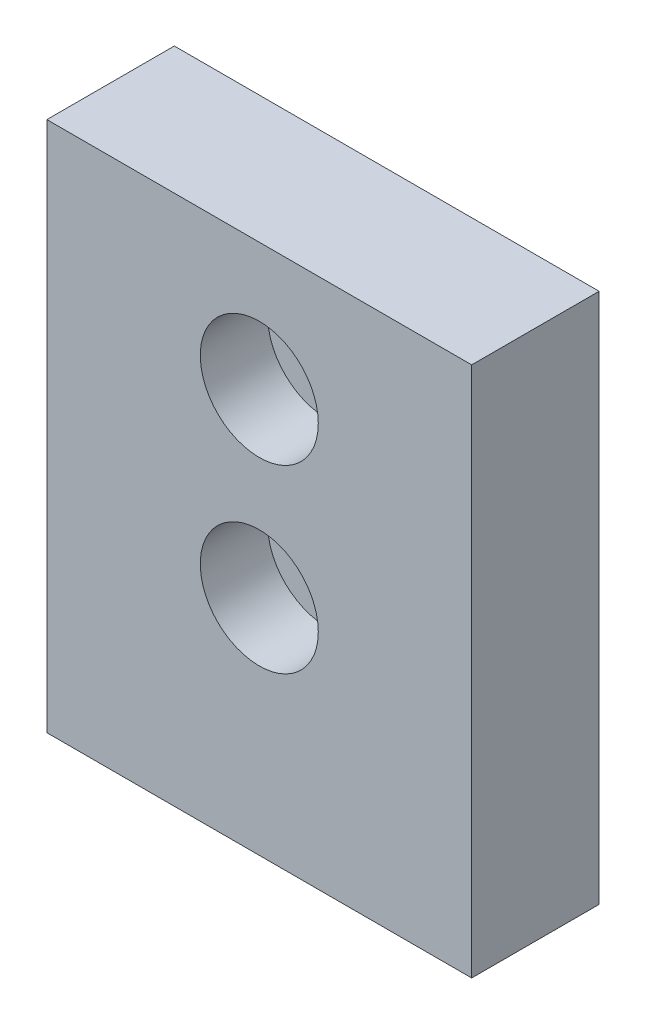
ISO-10303-21;
HEADER;
FILE_DESCRIPTION(('STEP AP214'),'2;1');
FILE_NAME('part.step','',(''),(''),'','','');
FILE_SCHEMA(('AUTOMOTIVE_DESIGN { 1 0 10303 214 1 1 1 1 }'));
ENDSEC;
DATA;
#1=APPLICATION_CONTEXT('core data for automotive mechanical design processes');
#2=APPLICATION_PROTOCOL_DEFINITION('international standard','automotive_design',2000,#1);
#3=PRODUCT_CONTEXT('',#1,'mechanical');
#4=PRODUCT('Part','Part','',(#3));
#5=PRODUCT_RELATED_PRODUCT_CATEGORY('part','',(#4));
#6=PRODUCT_DEFINITION_FORMATION('','',#4);
#7=PRODUCT_DEFINITION_CONTEXT('part definition',#1,'design');
#8=PRODUCT_DEFINITION('design','',#6,#7);
#9=PRODUCT_DEFINITION_SHAPE('','',#8);
#10=(LENGTH_UNIT() NAMED_UNIT(*) SI_UNIT(.MILLI.,.METRE.));
#11=(NAMED_UNIT(*) PLANE_ANGLE_UNIT() SI_UNIT($,.RADIAN.));
#12=(NAMED_UNIT(*) SI_UNIT($,.STERADIAN.) SOLID_ANGLE_UNIT());
#13=UNCERTAINTY_MEASURE_WITH_UNIT(LENGTH_MEASURE(1.E-05),#10,'distance_accuracy_value','');
#14=(GEOMETRIC_REPRESENTATION_CONTEXT(3) GLOBAL_UNCERTAINTY_ASSIGNED_CONTEXT((#13)) GLOBAL_UNIT_ASSIGNED_CONTEXT((#10,
#11,#12)) REPRESENTATION_CONTEXT('',''));
#15=CARTESIAN_POINT('',(0.,0.,0.));
#16=DIRECTION('',(0.,0.,1.));
#17=DIRECTION('',(1.,0.,0.));
#18=AXIS2_PLACEMENT_3D('',#15,#16,#17);
#19=CARTESIAN_POINT('',(0.,0.,12.));
#20=DIRECTION('',(0.,0.,-1.));
#21=DIRECTION('',(-1.,0.,0.));
#22=AXIS2_PLACEMENT_3D('',#19,#20,#21);
#23=PLANE('',#22);
#24=CARTESIAN_POINT('',(0.,21.,12.));
#25=DIRECTION('',(0.,0.,1.));
#26=DIRECTION('',(1.,0.,0.));
#27=AXIS2_PLACEMENT_3D('',#24,#25,#26);
#28=CIRCLE('',#27,5.55625);
#29=CARTESIAN_POINT('',(5.55625,21.,12.));
#30=VERTEX_POINT('',#29);
#31=EDGE_CURVE('E137',#30,#30,#28,.T.);
#32=ORIENTED_EDGE('',*,*,#31,.F.);
#33=EDGE_LOOP('',(#32));
#34=FACE_BOUND('',#33,.T.);
#35=DIRECTION('',(0.,-1.,0.));
#36=VECTOR('',#35,1.);
#37=CARTESIAN_POINT('',(-20.,0.,12.));
#38=LINE('',#37,#36);
#39=CARTESIAN_POINT('',(-20.,50.,12.));
#40=VERTEX_POINT('',#39);
#41=CARTESIAN_POINT('',(-20.,0.,12.));
#42=VERTEX_POINT('',#41);
#43=EDGE_CURVE('E150',#40,#42,#38,.T.);
#44=ORIENTED_EDGE('',*,*,#43,.T.);
#45=DIRECTION('',(1.,0.,0.));
#46=VECTOR('',#45,1.);
#47=CARTESIAN_POINT('',(20.,0.,12.));
#48=LINE('',#47,#46);
#49=CARTESIAN_POINT('',(20.,0.,12.));
#50=VERTEX_POINT('',#49);
#51=EDGE_CURVE('E88',#42,#50,#48,.T.);
#52=ORIENTED_EDGE('',*,*,#51,.T.);
#53=DIRECTION('',(0.,1.,0.));
#54=VECTOR('',#53,1.);
#55=CARTESIAN_POINT('',(20.,0.,12.));
#56=LINE('',#55,#54);
#57=CARTESIAN_POINT('',(20.,50.,12.));
#58=VERTEX_POINT('',#57);
#59=EDGE_CURVE('E153',#50,#58,#56,.T.);
#60=ORIENTED_EDGE('',*,*,#59,.T.);
#61=DIRECTION('',(-1.,0.,0.));
#62=VECTOR('',#61,1.);
#63=CARTESIAN_POINT('',(-20.,50.,12.));
#64=LINE('',#63,#62);
#65=EDGE_CURVE('E57',#58,#40,#64,.T.);
#66=ORIENTED_EDGE('',*,*,#65,.T.);
#67=EDGE_LOOP('',(#44,#52,#60,#66));
#68=FACE_BOUND('',#67,.T.);
#69=CARTESIAN_POINT('',(0.,38.,12.));
#70=DIRECTION('',(0.,0.,1.));
#71=DIRECTION('',(1.,0.,0.));
#72=AXIS2_PLACEMENT_3D('',#69,#70,#71);
#73=CIRCLE('',#72,5.55625);
#74=CARTESIAN_POINT('',(5.55625,38.,12.));
#75=VERTEX_POINT('',#74);
#76=EDGE_CURVE('E125',#75,#75,#73,.T.);
#77=ORIENTED_EDGE('',*,*,#76,.F.);
#78=EDGE_LOOP('',(#77));
#79=FACE_BOUND('',#78,.T.);
#80=ADVANCED_FACE('F40',(#34,#68,#79),#23,.F.);
#81=CARTESIAN_POINT('',(-20.,0.,12.));
#82=DIRECTION('',(1.,0.,0.));
#83=DIRECTION('',(0.,1.,0.));
#84=AXIS2_PLACEMENT_3D('',#81,#82,#83);
#85=PLANE('',#84);
#86=DIRECTION('',(0.,-1.,0.));
#87=VECTOR('',#86,1.);
#88=CARTESIAN_POINT('',(-20.,0.,0.));
#89=LINE('',#88,#87);
#90=CARTESIAN_POINT('',(-20.,50.,0.));
#91=VERTEX_POINT('',#90);
#92=CARTESIAN_POINT('',(-20.,0.,0.));
#93=VERTEX_POINT('',#92);
#94=EDGE_CURVE('E149',#91,#93,#89,.T.);
#95=ORIENTED_EDGE('',*,*,#94,.T.);
#96=DIRECTION('',(0.,0.,-1.));
#97=VECTOR('',#96,1.);
#98=CARTESIAN_POINT('',(-20.,0.,12.));
#99=LINE('',#98,#97);
#100=EDGE_CURVE('E11',#42,#93,#99,.T.);
#101=ORIENTED_EDGE('',*,*,#100,.F.);
#102=ORIENTED_EDGE('',*,*,#43,.F.);
#103=DIRECTION('',(0.,0.,-1.));
#104=VECTOR('',#103,1.);
#105=CARTESIAN_POINT('',(-20.,50.,12.));
#106=LINE('',#105,#104);
#107=EDGE_CURVE('E156',#40,#91,#106,.T.);
#108=ORIENTED_EDGE('',*,*,#107,.T.);
#109=EDGE_LOOP('',(#95,#101,#102,#108));
#110=FACE_BOUND('',#109,.T.);
#111=ADVANCED_FACE('F42',(#110),#85,.F.);
#112=CARTESIAN_POINT('',(20.,0.,12.));
#113=DIRECTION('',(0.,1.,0.));
#114=DIRECTION('',(-1.,0.,0.));
#115=AXIS2_PLACEMENT_3D('',#112,#113,#114);
#116=PLANE('',#115);
#117=CARTESIAN_POINT('',(-14.,0.,6.00000000000001));
#118=DIRECTION('',(0.,-1.,0.));
#119=DIRECTION('',(0.,0.,-1.));
#120=AXIS2_PLACEMENT_3D('',#117,#118,#119);
#121=CIRCLE('',#120,1.7272);
#122=CARTESIAN_POINT('',(-14.,0.,4.27280000000001));
#123=VERTEX_POINT('',#122);
#124=EDGE_CURVE('E109',#123,#123,#121,.T.);
#125=ORIENTED_EDGE('',*,*,#124,.F.);
#126=EDGE_LOOP('',(#125));
#127=FACE_BOUND('',#126,.T.);
#128=CARTESIAN_POINT('',(14.,0.,6.00000000000001));
#129=DIRECTION('',(0.,-1.,0.));
#130=DIRECTION('',(0.,0.,-1.));
#131=AXIS2_PLACEMENT_3D('',#128,#129,#130);
#132=CIRCLE('',#131,1.7272);
#133=CARTESIAN_POINT('',(14.,0.,4.27280000000001));
#134=VERTEX_POINT('',#133);
#135=EDGE_CURVE('E108',#134,#134,#132,.T.);
#136=ORIENTED_EDGE('',*,*,#135,.F.);
#137=EDGE_LOOP('',(#136));
#138=FACE_BOUND('',#137,.T.);
#139=CARTESIAN_POINT('',(0.,0.,6.00000000000001));
#140=DIRECTION('',(0.,-1.,0.));
#141=DIRECTION('',(0.,0.,-1.));
#142=AXIS2_PLACEMENT_3D('',#139,#140,#141);
#143=CIRCLE('',#142,1.7272);
#144=CARTESIAN_POINT('',(0.,0.,4.27280000000001));
#145=VERTEX_POINT('',#144);
#146=EDGE_CURVE('E119',#145,#145,#143,.T.);
#147=ORIENTED_EDGE('',*,*,#146,.F.);
#148=EDGE_LOOP('',(#147));
#149=FACE_BOUND('',#148,.T.);
#150=DIRECTION('',(1.,0.,0.));
#151=VECTOR('',#150,1.);
#152=CARTESIAN_POINT('',(20.,0.,0.));
#153=LINE('',#152,#151);
#154=CARTESIAN_POINT('',(20.,0.,0.));
#155=VERTEX_POINT('',#154);
#156=EDGE_CURVE('E159',#93,#155,#153,.T.);
#157=ORIENTED_EDGE('',*,*,#156,.T.);
#158=DIRECTION('',(0.,0.,-1.));
#159=VECTOR('',#158,1.);
#160=CARTESIAN_POINT('',(20.,0.,12.));
#161=LINE('',#160,#159);
#162=EDGE_CURVE('E49',#50,#155,#161,.T.);
#163=ORIENTED_EDGE('',*,*,#162,.F.);
#164=ORIENTED_EDGE('',*,*,#51,.F.);
#165=ORIENTED_EDGE('',*,*,#100,.T.);
#166=EDGE_LOOP('',(#157,#163,#164,#165));
#167=FACE_BOUND('',#166,.T.);
#168=ADVANCED_FACE('F183',(#127,#138,#149,#167),#116,.F.);
#169=CARTESIAN_POINT('',(20.,0.,12.));
#170=DIRECTION('',(-1.,0.,0.));
#171=DIRECTION('',(0.,0.,1.));
#172=AXIS2_PLACEMENT_3D('',#169,#170,#171);
#173=PLANE('',#172);
#174=DIRECTION('',(0.,1.,0.));
#175=VECTOR('',#174,1.);
#176=CARTESIAN_POINT('',(20.,0.,0.));
#177=LINE('',#176,#175);
#178=CARTESIAN_POINT('',(20.,50.,0.));
#179=VERTEX_POINT('',#178);
#180=EDGE_CURVE('E75',#155,#179,#177,.T.);
#181=ORIENTED_EDGE('',*,*,#180,.T.);
#182=DIRECTION('',(0.,0.,-1.));
#183=VECTOR('',#182,1.);
#184=CARTESIAN_POINT('',(20.,50.,12.));
#185=LINE('',#184,#183);
#186=EDGE_CURVE('E164',#58,#179,#185,.T.);
#187=ORIENTED_EDGE('',*,*,#186,.F.);
#188=ORIENTED_EDGE('',*,*,#59,.F.);
#189=ORIENTED_EDGE('',*,*,#162,.T.);
#190=EDGE_LOOP('',(#181,#187,#188,#189));
#191=FACE_BOUND('',#190,.T.);
#192=ADVANCED_FACE('F166',(#191),#173,.F.);
#193=CARTESIAN_POINT('',(-20.,50.,12.));
#194=DIRECTION('',(0.,-1.,0.));
#195=DIRECTION('',(1.,0.,0.));
#196=AXIS2_PLACEMENT_3D('',#193,#194,#195);
#197=PLANE('',#196);
#198=DIRECTION('',(-1.,0.,0.));
#199=VECTOR('',#198,1.);
#200=CARTESIAN_POINT('',(-20.,50.,0.));
#201=LINE('',#200,#199);
#202=EDGE_CURVE('E81',#179,#91,#201,.T.);
#203=ORIENTED_EDGE('',*,*,#202,.T.);
#204=ORIENTED_EDGE('',*,*,#107,.F.);
#205=ORIENTED_EDGE('',*,*,#65,.F.);
#206=ORIENTED_EDGE('',*,*,#186,.T.);
#207=EDGE_LOOP('',(#203,#204,#205,#206));
#208=FACE_BOUND('',#207,.T.);
#209=ADVANCED_FACE('F173',(#208),#197,.F.);
#210=CARTESIAN_POINT('',(0.,0.,0.));
#211=DIRECTION('',(0.,0.,-1.));
#212=DIRECTION('',(-1.,0.,0.));
#213=AXIS2_PLACEMENT_3D('',#210,#211,#212);
#214=PLANE('',#213);
#215=CARTESIAN_POINT('',(0.,38.,0.));
#216=DIRECTION('',(0.,0.,1.));
#217=DIRECTION('',(1.,0.,0.));
#218=AXIS2_PLACEMENT_3D('',#215,#216,#217);
#219=CIRCLE('',#218,3.3782);
#220=CARTESIAN_POINT('',(3.3782,38.,0.));
#221=VERTEX_POINT('',#220);
#222=EDGE_CURVE('E134',#221,#221,#219,.T.);
#223=ORIENTED_EDGE('',*,*,#222,.T.);
#224=EDGE_LOOP('',(#223));
#225=FACE_BOUND('',#224,.T.);
#226=CARTESIAN_POINT('',(0.,21.,0.));
#227=DIRECTION('',(0.,0.,1.));
#228=DIRECTION('',(1.,0.,0.));
#229=AXIS2_PLACEMENT_3D('',#226,#227,#228);
#230=CIRCLE('',#229,3.3782);
#231=CARTESIAN_POINT('',(3.3782,21.,0.));
#232=VERTEX_POINT('',#231);
#233=EDGE_CURVE('E146',#232,#232,#230,.T.);
#234=ORIENTED_EDGE('',*,*,#233,.T.);
#235=EDGE_LOOP('',(#234));
#236=FACE_BOUND('',#235,.T.);
#237=ORIENTED_EDGE('',*,*,#94,.F.);
#238=ORIENTED_EDGE('',*,*,#202,.F.);
#239=ORIENTED_EDGE('',*,*,#180,.F.);
#240=ORIENTED_EDGE('',*,*,#156,.F.);
#241=EDGE_LOOP('',(#237,#238,#239,#240));
#242=FACE_BOUND('',#241,.T.);
#243=ADVANCED_FACE('F169',(#225,#236,#242),#214,.T.);
#244=CARTESIAN_POINT('',(0.,21.,12.));
#245=DIRECTION('',(0.,0.,1.));
#246=DIRECTION('',(1.,0.,0.));
#247=AXIS2_PLACEMENT_3D('',#244,#245,#246);
#248=CYLINDRICAL_SURFACE('',#247,3.3782);
#249=ORIENTED_EDGE('',*,*,#233,.F.);
#250=EDGE_LOOP('',(#249));
#251=FACE_BOUND('',#250,.T.);
#252=CARTESIAN_POINT('',(0.,21.,5.65));
#253=DIRECTION('',(0.,0.,1.));
#254=DIRECTION('',(1.,0.,0.));
#255=AXIS2_PLACEMENT_3D('',#252,#253,#254);
#256=CIRCLE('',#255,3.3782);
#257=CARTESIAN_POINT('',(3.3782,21.,5.65));
#258=VERTEX_POINT('',#257);
#259=EDGE_CURVE('E143',#258,#258,#256,.T.);
#260=ORIENTED_EDGE('',*,*,#259,.T.);
#261=EDGE_LOOP('',(#260));
#262=FACE_BOUND('',#261,.T.);
#263=ADVANCED_FACE('F180',(#251,#262),#248,.F.);
#264=CARTESIAN_POINT('',(3.3782,21.,5.65));
#265=DIRECTION('',(0.,0.,-1.));
#266=DIRECTION('',(-1.,0.,0.));
#267=AXIS2_PLACEMENT_3D('',#264,#265,#266);
#268=PLANE('',#267);
#269=ORIENTED_EDGE('',*,*,#259,.F.);
#270=EDGE_LOOP('',(#269));
#271=FACE_BOUND('',#270,.T.);
#272=CARTESIAN_POINT('',(0.,21.,5.65));
#273=DIRECTION('',(0.,0.,1.));
#274=DIRECTION('',(1.,0.,0.));
#275=AXIS2_PLACEMENT_3D('',#272,#273,#274);
#276=CIRCLE('',#275,5.55625);
#277=CARTESIAN_POINT('',(5.55625,21.,5.65));
#278=VERTEX_POINT('',#277);
#279=EDGE_CURVE('E140',#278,#278,#276,.T.);
#280=ORIENTED_EDGE('',*,*,#279,.T.);
#281=EDGE_LOOP('',(#280));
#282=FACE_BOUND('',#281,.T.);
#283=ADVANCED_FACE('F195',(#271,#282),#268,.F.);
#284=CARTESIAN_POINT('',(0.,21.,12.));
#285=DIRECTION('',(0.,0.,1.));
#286=DIRECTION('',(1.,0.,0.));
#287=AXIS2_PLACEMENT_3D('',#284,#285,#286);
#288=CYLINDRICAL_SURFACE('',#287,5.55625);
#289=ORIENTED_EDGE('',*,*,#279,.F.);
#290=EDGE_LOOP('',(#289));
#291=FACE_BOUND('',#290,.T.);
#292=ORIENTED_EDGE('',*,*,#31,.T.);
#293=EDGE_LOOP('',(#292));
#294=FACE_BOUND('',#293,.T.);
#295=ADVANCED_FACE('F199',(#291,#294),#288,.F.);
#296=CARTESIAN_POINT('',(0.,38.,12.));
#297=DIRECTION('',(0.,0.,1.));
#298=DIRECTION('',(1.,0.,0.));
#299=AXIS2_PLACEMENT_3D('',#296,#297,#298);
#300=CYLINDRICAL_SURFACE('',#299,3.3782);
#301=ORIENTED_EDGE('',*,*,#222,.F.);
#302=EDGE_LOOP('',(#301));
#303=FACE_BOUND('',#302,.T.);
#304=CARTESIAN_POINT('',(0.,38.,5.65));
#305=DIRECTION('',(0.,0.,1.));
#306=DIRECTION('',(1.,0.,0.));
#307=AXIS2_PLACEMENT_3D('',#304,#305,#306);
#308=CIRCLE('',#307,3.3782);
#309=CARTESIAN_POINT('',(3.3782,38.,5.65));
#310=VERTEX_POINT('',#309);
#311=EDGE_CURVE('E131',#310,#310,#308,.T.);
#312=ORIENTED_EDGE('',*,*,#311,.T.);
#313=EDGE_LOOP('',(#312));
#314=FACE_BOUND('',#313,.T.);
#315=ADVANCED_FACE('F203',(#303,#314),#300,.F.);
#316=CARTESIAN_POINT('',(3.3782,38.,5.65));
#317=DIRECTION('',(0.,0.,-1.));
#318=DIRECTION('',(-1.,0.,0.));
#319=AXIS2_PLACEMENT_3D('',#316,#317,#318);
#320=PLANE('',#319);
#321=ORIENTED_EDGE('',*,*,#311,.F.);
#322=EDGE_LOOP('',(#321));
#323=FACE_BOUND('',#322,.T.);
#324=CARTESIAN_POINT('',(0.,38.,5.65));
#325=DIRECTION('',(0.,0.,1.));
#326=DIRECTION('',(1.,0.,0.));
#327=AXIS2_PLACEMENT_3D('',#324,#325,#326);
#328=CIRCLE('',#327,5.55625);
#329=CARTESIAN_POINT('',(5.55625,38.,5.65));
#330=VERTEX_POINT('',#329);
#331=EDGE_CURVE('E128',#330,#330,#328,.T.);
#332=ORIENTED_EDGE('',*,*,#331,.T.);
#333=EDGE_LOOP('',(#332));
#334=FACE_BOUND('',#333,.T.);
#335=ADVANCED_FACE('F207',(#323,#334),#320,.F.);
#336=CARTESIAN_POINT('',(0.,38.,12.));
#337=DIRECTION('',(0.,0.,1.));
#338=DIRECTION('',(1.,0.,0.));
#339=AXIS2_PLACEMENT_3D('',#336,#337,#338);
#340=CYLINDRICAL_SURFACE('',#339,5.55625);
#341=ORIENTED_EDGE('',*,*,#331,.F.);
#342=EDGE_LOOP('',(#341));
#343=FACE_BOUND('',#342,.T.);
#344=ORIENTED_EDGE('',*,*,#76,.T.);
#345=EDGE_LOOP('',(#344));
#346=FACE_BOUND('',#345,.T.);
#347=ADVANCED_FACE('F211',(#343,#346),#340,.F.);
#348=CARTESIAN_POINT('',(0.,12.7,6.00000000000001));
#349=DIRECTION('',(0.,-1.,0.));
#350=DIRECTION('',(0.,0.,-1.));
#351=AXIS2_PLACEMENT_3D('',#348,#349,#350);
#352=CONICAL_SURFACE('',#351,1.7272,1.02974425867665);
#353=CARTESIAN_POINT('',(0.,13.7378064611844,6.00000000000001));
#354=VERTEX_POINT('',#353);
#355=VERTEX_LOOP('',#354);
#356=FACE_BOUND('',#355,.T.);
#357=CARTESIAN_POINT('',(0.,12.7,6.00000000000001));
#358=DIRECTION('',(0.,-1.,0.));
#359=DIRECTION('',(0.,0.,-1.));
#360=AXIS2_PLACEMENT_3D('',#357,#358,#359);
#361=CIRCLE('',#360,1.7272);
#362=CARTESIAN_POINT('',(0.,12.7,4.27280000000001));
#363=VERTEX_POINT('',#362);
#364=EDGE_CURVE('E122',#363,#363,#361,.T.);
#365=ORIENTED_EDGE('',*,*,#364,.T.);
#366=EDGE_LOOP('',(#365));
#367=FACE_BOUND('',#366,.T.);
#368=ADVANCED_FACE('F215',(#356,#367),#352,.F.);
#369=CARTESIAN_POINT('',(0.,0.,6.00000000000001));
#370=DIRECTION('',(0.,-1.,0.));
#371=DIRECTION('',(0.,0.,-1.));
#372=AXIS2_PLACEMENT_3D('',#369,#370,#371);
#373=CYLINDRICAL_SURFACE('',#372,1.7272);
#374=ORIENTED_EDGE('',*,*,#364,.F.);
#375=EDGE_LOOP('',(#374));
#376=FACE_BOUND('',#375,.T.);
#377=ORIENTED_EDGE('',*,*,#146,.T.);
#378=EDGE_LOOP('',(#377));
#379=FACE_BOUND('',#378,.T.);
#380=ADVANCED_FACE('F219',(#376,#379),#373,.F.);
#381=CARTESIAN_POINT('',(14.,12.7,6.00000000000001));
#382=DIRECTION('',(0.,-1.,0.));
#383=DIRECTION('',(0.,0.,-1.));
#384=AXIS2_PLACEMENT_3D('',#381,#382,#383);
#385=CONICAL_SURFACE('',#384,1.7272,1.02974425867665);
#386=CARTESIAN_POINT('',(14.,13.7378064611844,6.00000000000001));
#387=VERTEX_POINT('',#386);
#388=VERTEX_LOOP('',#387);
#389=FACE_BOUND('',#388,.T.);
#390=CARTESIAN_POINT('',(14.,12.7,6.00000000000001));
#391=DIRECTION('',(0.,-1.,0.));
#392=DIRECTION('',(0.,0.,-1.));
#393=AXIS2_PLACEMENT_3D('',#390,#391,#392);
#394=CIRCLE('',#393,1.7272);
#395=CARTESIAN_POINT('',(14.,12.7,4.27280000000001));
#396=VERTEX_POINT('',#395);
#397=EDGE_CURVE('E112',#396,#396,#394,.T.);
#398=ORIENTED_EDGE('',*,*,#397,.T.);
#399=EDGE_LOOP('',(#398));
#400=FACE_BOUND('',#399,.T.);
#401=ADVANCED_FACE('F223',(#389,#400),#385,.F.);
#402=CARTESIAN_POINT('',(14.,0.,6.00000000000001));
#403=DIRECTION('',(0.,-1.,0.));
#404=DIRECTION('',(0.,0.,-1.));
#405=AXIS2_PLACEMENT_3D('',#402,#403,#404);
#406=CYLINDRICAL_SURFACE('',#405,1.7272);
#407=ORIENTED_EDGE('',*,*,#397,.F.);
#408=EDGE_LOOP('',(#407));
#409=FACE_BOUND('',#408,.T.);
#410=ORIENTED_EDGE('',*,*,#135,.T.);
#411=EDGE_LOOP('',(#410));
#412=FACE_BOUND('',#411,.T.);
#413=ADVANCED_FACE('F102',(#409,#412),#406,.F.);
#414=CARTESIAN_POINT('',(-14.,12.7,6.00000000000001));
#415=DIRECTION('',(0.,-1.,0.));
#416=DIRECTION('',(0.,0.,-1.));
#417=AXIS2_PLACEMENT_3D('',#414,#415,#416);
#418=CONICAL_SURFACE('',#417,1.7272,1.02974425867665);
#419=CARTESIAN_POINT('',(-14.,13.7378064611844,6.00000000000001));
#420=VERTEX_POINT('',#419);
#421=VERTEX_LOOP('',#420);
#422=FACE_BOUND('',#421,.T.);
#423=CARTESIAN_POINT('',(-14.,12.7,6.00000000000001));
#424=DIRECTION('',(0.,-1.,0.));
#425=DIRECTION('',(0.,0.,-1.));
#426=AXIS2_PLACEMENT_3D('',#423,#424,#425);
#427=CIRCLE('',#426,1.7272);
#428=CARTESIAN_POINT('',(-14.,12.7,4.27280000000001));
#429=VERTEX_POINT('',#428);
#430=EDGE_CURVE('E106',#429,#429,#427,.T.);
#431=ORIENTED_EDGE('',*,*,#430,.T.);
#432=EDGE_LOOP('',(#431));
#433=FACE_BOUND('',#432,.T.);
#434=ADVANCED_FACE('F98',(#422,#433),#418,.F.);
#435=CARTESIAN_POINT('',(-14.,0.,6.00000000000001));
#436=DIRECTION('',(0.,-1.,0.));
#437=DIRECTION('',(0.,0.,-1.));
#438=AXIS2_PLACEMENT_3D('',#435,#436,#437);
#439=CYLINDRICAL_SURFACE('',#438,1.7272);
#440=ORIENTED_EDGE('',*,*,#430,.F.);
#441=EDGE_LOOP('',(#440));
#442=FACE_BOUND('',#441,.T.);
#443=ORIENTED_EDGE('',*,*,#124,.T.);
#444=EDGE_LOOP('',(#443));
#445=FACE_BOUND('',#444,.T.);
#446=ADVANCED_FACE('F101',(#442,#445),#439,.F.);
#447=CLOSED_SHELL('',(#80,#111,#168,#192,#209,#243,#263,#283,#295,#315,#335,#347,#368,#380,#401,
#413,#434,#446));
#448=MANIFOLD_SOLID_BREP('B2',#447);
#449=ADVANCED_BREP_SHAPE_REPRESENTATION('',(#18,#448),#14);
#450=SHAPE_DEFINITION_REPRESENTATION(#9,#449);
ENDSEC;
END-ISO-10303-21;
